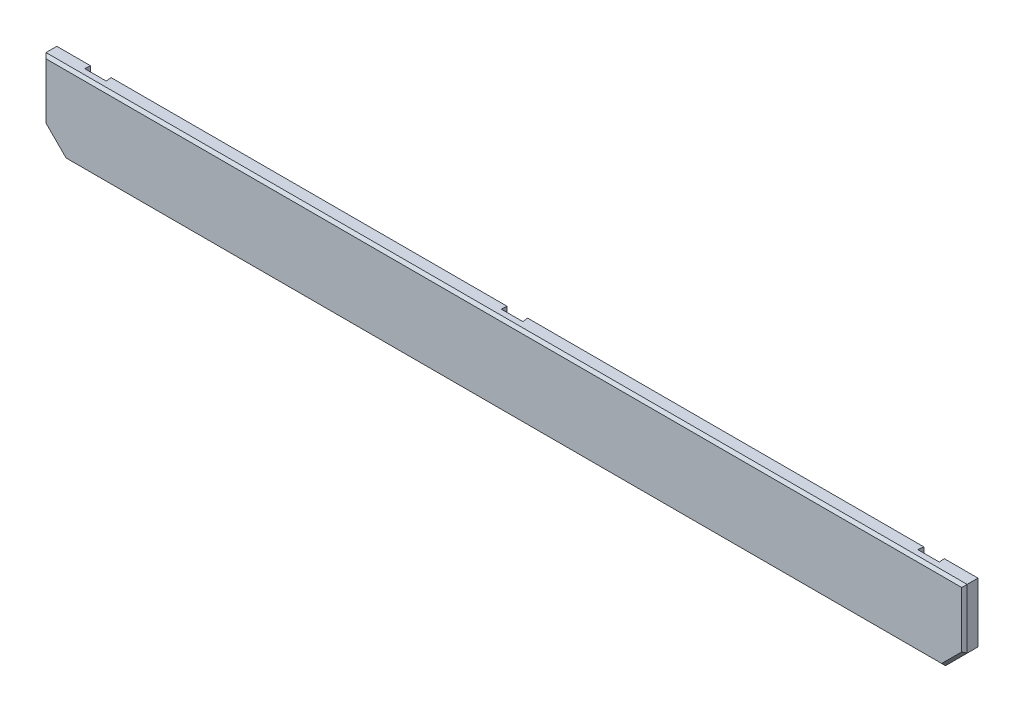
ISO-10303-21;
HEADER;
FILE_DESCRIPTION(('STEP AP214'),'2;1');
FILE_NAME('part.step','',(''),(''),'','','');
FILE_SCHEMA(('AUTOMOTIVE_DESIGN { 1 0 10303 214 1 1 1 1 }'));
ENDSEC;
DATA;
#1=APPLICATION_CONTEXT('core data for automotive mechanical design processes');
#2=APPLICATION_PROTOCOL_DEFINITION('international standard','automotive_design',2000,#1);
#3=PRODUCT_CONTEXT('',#1,'mechanical');
#4=PRODUCT('Part','Part','',(#3));
#5=PRODUCT_RELATED_PRODUCT_CATEGORY('part','',(#4));
#6=PRODUCT_DEFINITION_FORMATION('','',#4);
#7=PRODUCT_DEFINITION_CONTEXT('part definition',#1,'design');
#8=PRODUCT_DEFINITION('design','',#6,#7);
#9=PRODUCT_DEFINITION_SHAPE('','',#8);
#10=(LENGTH_UNIT() NAMED_UNIT(*) SI_UNIT(.MILLI.,.METRE.));
#11=(NAMED_UNIT(*) PLANE_ANGLE_UNIT() SI_UNIT($,.RADIAN.));
#12=(NAMED_UNIT(*) SI_UNIT($,.STERADIAN.) SOLID_ANGLE_UNIT());
#13=UNCERTAINTY_MEASURE_WITH_UNIT(LENGTH_MEASURE(1.E-05),#10,'distance_accuracy_value','');
#14=(GEOMETRIC_REPRESENTATION_CONTEXT(3) GLOBAL_UNCERTAINTY_ASSIGNED_CONTEXT((#13)) GLOBAL_UNIT_ASSIGNED_CONTEXT((#10,
#11,#12)) REPRESENTATION_CONTEXT('',''));
#15=CARTESIAN_POINT('',(0.,0.,0.));
#16=DIRECTION('',(0.,0.,1.));
#17=DIRECTION('',(1.,0.,0.));
#18=AXIS2_PLACEMENT_3D('',#15,#16,#17);
#19=CARTESIAN_POINT('',(0.,0.,0.));
#20=DIRECTION('',(0.,0.,-1.));
#21=DIRECTION('',(-1.,0.,0.));
#22=AXIS2_PLACEMENT_3D('',#19,#20,#21);
#23=PLANE('',#22);
#24=DIRECTION('',(0.,1.,0.));
#25=VECTOR('',#24,1.);
#26=CARTESIAN_POINT('',(100.,0.,0.));
#27=LINE('',#26,#25);
#28=CARTESIAN_POINT('',(100.,0.,0.));
#29=VERTEX_POINT('',#28);
#30=CARTESIAN_POINT('',(100.,150.,0.));
#31=VERTEX_POINT('',#30);
#32=EDGE_CURVE('E212',#29,#31,#27,.T.);
#33=ORIENTED_EDGE('',*,*,#32,.T.);
#34=DIRECTION('',(-1.,0.,0.));
#35=VECTOR('',#34,1.);
#36=CARTESIAN_POINT('',(0.,150.,0.));
#37=LINE('',#36,#35);
#38=CARTESIAN_POINT('',(831.227845609029,150.,0.));
#39=VERTEX_POINT('',#38);
#40=EDGE_CURVE('E405',#39,#31,#37,.T.);
#41=ORIENTED_EDGE('',*,*,#40,.F.);
#42=DIRECTION('',(0.,1.,0.));
#43=VECTOR('',#42,1.);
#44=CARTESIAN_POINT('',(831.227845609029,0.,0.));
#45=LINE('',#44,#43);
#46=CARTESIAN_POINT('',(831.227845609029,0.,0.));
#47=VERTEX_POINT('',#46);
#48=EDGE_CURVE('E250',#47,#39,#45,.T.);
#49=ORIENTED_EDGE('',*,*,#48,.F.);
#50=DIRECTION('',(1.,0.,0.));
#51=VECTOR('',#50,1.);
#52=CARTESIAN_POINT('',(0.,0.,0.));
#53=LINE('',#52,#51);
#54=EDGE_CURVE('E275',#29,#47,#53,.T.);
#55=ORIENTED_EDGE('',*,*,#54,.F.);
#56=EDGE_LOOP('',(#33,#41,#49,#55));
#57=FACE_BOUND('',#56,.T.);
#58=ADVANCED_FACE('F35',(#57),#23,.T.);
#59=DIRECTION('',(0.,1.,0.));
#60=VECTOR('',#59,1.);
#61=CARTESIAN_POINT('',(1700.,0.,0.));
#62=LINE('',#61,#60);
#63=CARTESIAN_POINT('',(1700.,40.0000000000003,0.));
#64=VERTEX_POINT('',#63);
#65=CARTESIAN_POINT('',(1700.,150.,0.));
#66=VERTEX_POINT('',#65);
#67=EDGE_CURVE('E274',#64,#66,#62,.T.);
#68=ORIENTED_EDGE('',*,*,#67,.F.);
#69=DIRECTION('',(0.707106781186548,0.707106781186548,0.));
#70=VECTOR('',#69,1.);
#71=CARTESIAN_POINT('',(830.,-830.,0.));
#72=LINE('',#71,#70);
#73=CARTESIAN_POINT('',(1660.,0.,0.));
#74=VERTEX_POINT('',#73);
#75=EDGE_CURVE('E305',#64,#74,#72,.F.);
#76=ORIENTED_EDGE('',*,*,#75,.T.);
#77=CARTESIAN_POINT('',(1637.54430878194,0.,0.));
#78=VERTEX_POINT('',#77);
#79=EDGE_CURVE('E272',#78,#74,#53,.T.);
#80=ORIENTED_EDGE('',*,*,#79,.F.);
#81=DIRECTION('',(0.,1.,0.));
#82=VECTOR('',#81,1.);
#83=CARTESIAN_POINT('',(1637.54430878194,0.,0.));
#84=LINE('',#83,#82);
#85=CARTESIAN_POINT('',(1637.54430878194,150.,0.));
#86=VERTEX_POINT('',#85);
#87=EDGE_CURVE('E205',#78,#86,#84,.T.);
#88=ORIENTED_EDGE('',*,*,#87,.T.);
#89=EDGE_CURVE('E279',#66,#86,#37,.T.);
#90=ORIENTED_EDGE('',*,*,#89,.F.);
#91=EDGE_LOOP('',(#68,#76,#80,#88,#90));
#92=FACE_BOUND('',#91,.T.);
#93=ADVANCED_FACE('F389',(#92),#23,.T.);
#94=DIRECTION('',(0.,1.,0.));
#95=VECTOR('',#94,1.);
#96=CARTESIAN_POINT('',(1600.,0.,0.));
#97=LINE('',#96,#95);
#98=CARTESIAN_POINT('',(1600.,0.,0.));
#99=VERTEX_POINT('',#98);
#100=CARTESIAN_POINT('',(1600.,150.,0.));
#101=VERTEX_POINT('',#100);
#102=EDGE_CURVE('E227',#99,#101,#97,.T.);
#103=ORIENTED_EDGE('',*,*,#102,.F.);
#104=CARTESIAN_POINT('',(868.772154390971,0.,0.));
#105=VERTEX_POINT('',#104);
#106=EDGE_CURVE('E414',#105,#99,#53,.T.);
#107=ORIENTED_EDGE('',*,*,#106,.F.);
#108=DIRECTION('',(0.,1.,0.));
#109=VECTOR('',#108,1.);
#110=CARTESIAN_POINT('',(868.772154390971,0.,0.));
#111=LINE('',#110,#109);
#112=CARTESIAN_POINT('',(868.772154390971,150.,0.));
#113=VERTEX_POINT('',#112);
#114=EDGE_CURVE('E244',#105,#113,#111,.T.);
#115=ORIENTED_EDGE('',*,*,#114,.T.);
#116=EDGE_CURVE('E283',#101,#113,#37,.T.);
#117=ORIENTED_EDGE('',*,*,#116,.F.);
#118=EDGE_LOOP('',(#103,#107,#115,#117));
#119=FACE_BOUND('',#118,.T.);
#120=ADVANCED_FACE('F402',(#119),#23,.T.);
#121=CARTESIAN_POINT('',(0.,0.,25.));
#122=DIRECTION('',(1.,0.,0.));
#123=DIRECTION('',(0.,0.,-1.));
#124=AXIS2_PLACEMENT_3D('',#121,#122,#123);
#125=PLANE('',#124);
#126=DIRECTION('',(0.,0.,1.));
#127=VECTOR('',#126,1.);
#128=CARTESIAN_POINT('',(0.,40.0000000000003,25.));
#129=LINE('',#128,#127);
#130=CARTESIAN_POINT('',(0.,40.0000000000003,0.));
#131=VERTEX_POINT('',#130);
#132=CARTESIAN_POINT('',(0.,40.0000000000003,20.0000000000001));
#133=VERTEX_POINT('',#132);
#134=EDGE_CURVE('E301',#131,#133,#129,.T.);
#135=ORIENTED_EDGE('',*,*,#134,.T.);
#136=DIRECTION('',(0.,1.,0.));
#137=VECTOR('',#136,1.);
#138=CARTESIAN_POINT('',(0.,0.,20.0000000000001));
#139=LINE('',#138,#137);
#140=CARTESIAN_POINT('',(0.,150.,20.0000000000001));
#141=VERTEX_POINT('',#140);
#142=EDGE_CURVE('E11',#133,#141,#139,.T.);
#143=ORIENTED_EDGE('',*,*,#142,.T.);
#144=DIRECTION('',(0.,0.,-1.));
#145=VECTOR('',#144,1.);
#146=CARTESIAN_POINT('',(0.,150.,25.));
#147=LINE('',#146,#145);
#148=CARTESIAN_POINT('',(0.,150.,0.));
#149=VERTEX_POINT('',#148);
#150=EDGE_CURVE('E282',#141,#149,#147,.T.);
#151=ORIENTED_EDGE('',*,*,#150,.T.);
#152=DIRECTION('',(0.,-1.,0.));
#153=VECTOR('',#152,1.);
#154=CARTESIAN_POINT('',(0.,0.,0.));
#155=LINE('',#154,#153);
#156=EDGE_CURVE('E269',#149,#131,#155,.T.);
#157=ORIENTED_EDGE('',*,*,#156,.T.);
#158=EDGE_LOOP('',(#135,#143,#151,#157));
#159=FACE_BOUND('',#158,.T.);
#160=ADVANCED_FACE('F361',(#159),#125,.F.);
#161=CARTESIAN_POINT('',(0.,0.,25.));
#162=DIRECTION('',(0.,1.,0.));
#163=DIRECTION('',(0.,0.,1.));
#164=AXIS2_PLACEMENT_3D('',#161,#162,#163);
#165=PLANE('',#164);
#166=DIRECTION('',(0.,0.,1.));
#167=VECTOR('',#166,1.);
#168=CARTESIAN_POINT('',(1660.,0.,25.));
#169=LINE('',#168,#167);
#170=CARTESIAN_POINT('',(1660.,0.,20.0000000000001));
#171=VERTEX_POINT('',#170);
#172=EDGE_CURVE('E295',#74,#171,#169,.T.);
#173=ORIENTED_EDGE('',*,*,#172,.T.);
#174=DIRECTION('',(-1.,0.,0.));
#175=VECTOR('',#174,1.);
#176=CARTESIAN_POINT('',(0.,0.,20.0000000000001));
#177=LINE('',#176,#175);
#178=CARTESIAN_POINT('',(40.0000000000003,0.,20.0000000000001));
#179=VERTEX_POINT('',#178);
#180=EDGE_CURVE('E60',#171,#179,#177,.T.);
#181=ORIENTED_EDGE('',*,*,#180,.T.);
#182=DIRECTION('',(0.,0.,-1.));
#183=VECTOR('',#182,1.);
#184=CARTESIAN_POINT('',(40.0000000000003,0.,25.));
#185=LINE('',#184,#183);
#186=CARTESIAN_POINT('',(40.0000000000003,0.,0.));
#187=VERTEX_POINT('',#186);
#188=EDGE_CURVE('E297',#179,#187,#185,.T.);
#189=ORIENTED_EDGE('',*,*,#188,.T.);
#190=CARTESIAN_POINT('',(62.4556912180578,0.,0.));
#191=VERTEX_POINT('',#190);
#192=EDGE_CURVE('E204',#187,#191,#53,.T.);
#193=ORIENTED_EDGE('',*,*,#192,.T.);
#194=DIRECTION('',(-0.121869343405132,0.,0.992546151641324));
#195=VECTOR('',#194,1.);
#196=CARTESIAN_POINT('',(62.4556912180578,0.,0.));
#197=LINE('',#196,#195);
#198=CARTESIAN_POINT('',(61.2278456090289,0.,10.));
#199=VERTEX_POINT('',#198);
#200=EDGE_CURVE('E185',#191,#199,#197,.T.);
#201=ORIENTED_EDGE('',*,*,#200,.T.);
#202=DIRECTION('',(1.,0.,0.));
#203=VECTOR('',#202,1.);
#204=CARTESIAN_POINT('',(101.227845609029,0.,10.));
#205=LINE('',#204,#203);
#206=CARTESIAN_POINT('',(101.227845609029,0.,10.));
#207=VERTEX_POINT('',#206);
#208=EDGE_CURVE('E195',#199,#207,#205,.T.);
#209=ORIENTED_EDGE('',*,*,#208,.T.);
#210=DIRECTION('',(-0.12186934340514,0.,-0.992546151641323));
#211=VECTOR('',#210,1.);
#212=CARTESIAN_POINT('',(100.,0.,0.));
#213=LINE('',#212,#211);
#214=EDGE_CURVE('E200',#207,#29,#213,.T.);
#215=ORIENTED_EDGE('',*,*,#214,.T.);
#216=ORIENTED_EDGE('',*,*,#54,.T.);
#217=DIRECTION('',(-0.121869343405143,0.,0.992546151641323));
#218=VECTOR('',#217,1.);
#219=CARTESIAN_POINT('',(831.227845609029,0.,0.));
#220=LINE('',#219,#218);
#221=CARTESIAN_POINT('',(830.,0.,10.));
#222=VERTEX_POINT('',#221);
#223=EDGE_CURVE('E238',#47,#222,#220,.T.);
#224=ORIENTED_EDGE('',*,*,#223,.T.);
#225=DIRECTION('',(1.,0.,0.));
#226=VECTOR('',#225,1.);
#227=CARTESIAN_POINT('',(830.,0.,10.));
#228=LINE('',#227,#226);
#229=CARTESIAN_POINT('',(870.,0.,10.));
#230=VERTEX_POINT('',#229);
#231=EDGE_CURVE('E241',#222,#230,#228,.T.);
#232=ORIENTED_EDGE('',*,*,#231,.T.);
#233=DIRECTION('',(-0.121869343405165,0.,-0.99254615164132));
#234=VECTOR('',#233,1.);
#235=CARTESIAN_POINT('',(868.772154390971,0.,0.));
#236=LINE('',#235,#234);
#237=EDGE_CURVE('E235',#230,#105,#236,.T.);
#238=ORIENTED_EDGE('',*,*,#237,.T.);
#239=ORIENTED_EDGE('',*,*,#106,.T.);
#240=DIRECTION('',(-0.121869343405132,0.,0.992546151641324));
#241=VECTOR('',#240,1.);
#242=CARTESIAN_POINT('',(1600.,0.,0.));
#243=LINE('',#242,#241);
#244=CARTESIAN_POINT('',(1598.77215439097,0.,10.));
#245=VERTEX_POINT('',#244);
#246=EDGE_CURVE('E218',#99,#245,#243,.T.);
#247=ORIENTED_EDGE('',*,*,#246,.T.);
#248=DIRECTION('',(1.,0.,0.));
#249=VECTOR('',#248,1.);
#250=CARTESIAN_POINT('',(1598.77215439097,0.,10.));
#251=LINE('',#250,#249);
#252=CARTESIAN_POINT('',(1638.77215439097,0.,10.));
#253=VERTEX_POINT('',#252);
#254=EDGE_CURVE('E221',#245,#253,#251,.T.);
#255=ORIENTED_EDGE('',*,*,#254,.T.);
#256=DIRECTION('',(-0.121869343405132,0.,-0.992546151641324));
#257=VECTOR('',#256,1.);
#258=CARTESIAN_POINT('',(1637.54430878194,0.,0.));
#259=LINE('',#258,#257);
#260=EDGE_CURVE('E225',#253,#78,#259,.T.);
#261=ORIENTED_EDGE('',*,*,#260,.T.);
#262=ORIENTED_EDGE('',*,*,#79,.T.);
#263=EDGE_LOOP('',(#173,#181,#189,#193,#201,#209,#215,#216,#224,#232,#238,#239,#247,#255,#261,#262));
#264=FACE_BOUND('',#263,.T.);
#265=ADVANCED_FACE('F202',(#264),#165,.F.);
#266=CARTESIAN_POINT('',(1700.,0.,25.));
#267=DIRECTION('',(-1.,0.,0.));
#268=DIRECTION('',(0.,0.,1.));
#269=AXIS2_PLACEMENT_3D('',#266,#267,#268);
#270=PLANE('',#269);
#271=DIRECTION('',(0.,0.,-1.));
#272=VECTOR('',#271,1.);
#273=CARTESIAN_POINT('',(1700.,150.,25.));
#274=LINE('',#273,#272);
#275=CARTESIAN_POINT('',(1700.,150.,20.0000000000001));
#276=VERTEX_POINT('',#275);
#277=EDGE_CURVE('E285',#276,#66,#274,.T.);
#278=ORIENTED_EDGE('',*,*,#277,.F.);
#279=DIRECTION('',(0.,-1.,0.));
#280=VECTOR('',#279,1.);
#281=CARTESIAN_POINT('',(1700.,0.,20.0000000000001));
#282=LINE('',#281,#280);
#283=CARTESIAN_POINT('',(1700.,40.0000000000003,20.0000000000001));
#284=VERTEX_POINT('',#283);
#285=EDGE_CURVE('E323',#276,#284,#282,.T.);
#286=ORIENTED_EDGE('',*,*,#285,.T.);
#287=DIRECTION('',(0.,0.,-1.));
#288=VECTOR('',#287,1.);
#289=CARTESIAN_POINT('',(1700.,40.0000000000003,25.));
#290=LINE('',#289,#288);
#291=EDGE_CURVE('E303',#284,#64,#290,.T.);
#292=ORIENTED_EDGE('',*,*,#291,.T.);
#293=ORIENTED_EDGE('',*,*,#67,.T.);
#294=EDGE_LOOP('',(#278,#286,#292,#293));
#295=FACE_BOUND('',#294,.T.);
#296=ADVANCED_FACE('F379',(#295),#270,.F.);
#297=CARTESIAN_POINT('',(0.,150.,25.));
#298=DIRECTION('',(0.,-1.,0.));
#299=DIRECTION('',(0.,0.,-1.));
#300=AXIS2_PLACEMENT_3D('',#297,#298,#299);
#301=PLANE('',#300);
#302=ORIENTED_EDGE('',*,*,#150,.F.);
#303=DIRECTION('',(1.,0.,0.));
#304=VECTOR('',#303,1.);
#305=CARTESIAN_POINT('',(0.,150.,20.0000000000001));
#306=LINE('',#305,#304);
#307=EDGE_CURVE('E320',#141,#276,#306,.T.);
#308=ORIENTED_EDGE('',*,*,#307,.T.);
#309=ORIENTED_EDGE('',*,*,#277,.T.);
#310=ORIENTED_EDGE('',*,*,#89,.T.);
#311=DIRECTION('',(0.121869343405132,0.,0.992546151641324));
#312=VECTOR('',#311,1.);
#313=CARTESIAN_POINT('',(1616.24730028532,150.,-173.450215076013));
#314=LINE('',#313,#312);
#315=CARTESIAN_POINT('',(1638.77215439097,150.,10.));
#316=VERTEX_POINT('',#315);
#317=EDGE_CURVE('E262',#86,#316,#314,.T.);
#318=ORIENTED_EDGE('',*,*,#317,.T.);
#319=DIRECTION('',(-1.,0.,0.));
#320=VECTOR('',#319,1.);
#321=CARTESIAN_POINT('',(0.,150.,10.));
#322=LINE('',#321,#320);
#323=CARTESIAN_POINT('',(1598.77215439097,150.,10.));
#324=VERTEX_POINT('',#323);
#325=EDGE_CURVE('E290',#316,#324,#322,.T.);
#326=ORIENTED_EDGE('',*,*,#325,.T.);
#327=DIRECTION('',(0.121869343405132,0.,-0.992546151641324));
#328=VECTOR('',#327,1.);
#329=CARTESIAN_POINT('',(1573.21255732581,150.,218.16621305816));
#330=LINE('',#329,#328);
#331=EDGE_CURVE('E259',#324,#101,#330,.T.);
#332=ORIENTED_EDGE('',*,*,#331,.T.);
#333=ORIENTED_EDGE('',*,*,#116,.T.);
#334=DIRECTION('',(0.121869343405165,0.,0.99254615164132));
#335=VECTOR('',#334,1.);
#336=CARTESIAN_POINT('',(858.893055147053,150.,-80.4588066388001));
#337=LINE('',#336,#335);
#338=CARTESIAN_POINT('',(870.,150.,10.));
#339=VERTEX_POINT('',#338);
#340=EDGE_CURVE('E256',#113,#339,#337,.T.);
#341=ORIENTED_EDGE('',*,*,#340,.T.);
#342=DIRECTION('',(-1.,0.,0.));
#343=VECTOR('',#342,1.);
#344=CARTESIAN_POINT('',(0.,150.,10.));
#345=LINE('',#344,#343);
#346=CARTESIAN_POINT('',(830.,150.,10.));
#347=VERTEX_POINT('',#346);
#348=EDGE_CURVE('E287',#339,#347,#345,.T.);
#349=ORIENTED_EDGE('',*,*,#348,.T.);
#350=DIRECTION('',(0.121869343405143,0.,-0.992546151641323));
#351=VECTOR('',#350,1.);
#352=CARTESIAN_POINT('',(815.858312187542,150.,125.174804620928));
#353=LINE('',#352,#351);
#354=EDGE_CURVE('E215',#347,#39,#353,.T.);
#355=ORIENTED_EDGE('',*,*,#354,.T.);
#356=ORIENTED_EDGE('',*,*,#40,.T.);
#357=DIRECTION('',(0.12186934340514,0.,0.992546151641323));
#358=VECTOR('',#357,1.);
#359=CARTESIAN_POINT('',(101.538810008796,150.,12.5326017984673));
#360=LINE('',#359,#358);
#361=CARTESIAN_POINT('',(101.227845609029,150.,10.));
#362=VERTEX_POINT('',#361);
#363=EDGE_CURVE('E266',#31,#362,#360,.T.);
#364=ORIENTED_EDGE('',*,*,#363,.T.);
#365=DIRECTION('',(-1.,0.,0.));
#366=VECTOR('',#365,1.);
#367=CARTESIAN_POINT('',(0.,150.,10.));
#368=LINE('',#367,#366);
#369=CARTESIAN_POINT('',(61.2278456090289,150.,10.));
#370=VERTEX_POINT('',#369);
#371=EDGE_CURVE('E293',#362,#370,#368,.T.);
#372=ORIENTED_EDGE('',*,*,#371,.T.);
#373=DIRECTION('',(0.121869343405132,0.,-0.992546151641324));
#374=VECTOR('',#373,1.);
#375=CARTESIAN_POINT('',(58.5040670492811,150.,32.1833961836791));
#376=LINE('',#375,#374);
#377=CARTESIAN_POINT('',(62.4556912180578,150.,0.));
#378=VERTEX_POINT('',#377);
#379=EDGE_CURVE('E188',#370,#378,#376,.T.);
#380=ORIENTED_EDGE('',*,*,#379,.T.);
#381=EDGE_CURVE('E278',#378,#149,#37,.T.);
#382=ORIENTED_EDGE('',*,*,#381,.T.);
#383=EDGE_LOOP('',(#302,#308,#309,#310,#318,#326,#332,#333,#341,#349,#355,#356,#364,#372,#380,#382));
#384=FACE_BOUND('',#383,.T.);
#385=ADVANCED_FACE('F365',(#384),#301,.F.);
#386=CARTESIAN_POINT('',(0.,0.,25.));
#387=DIRECTION('',(0.,0.,-1.));
#388=DIRECTION('',(-1.,0.,0.));
#389=AXIS2_PLACEMENT_3D('',#386,#387,#388);
#390=PLANE('',#389);
#391=DIRECTION('',(0.,1.,0.));
#392=VECTOR('',#391,1.);
#393=CARTESIAN_POINT('',(1695.,0.,25.));
#394=LINE('',#393,#392);
#395=CARTESIAN_POINT('',(1695.,42.0710678118657,25.));
#396=VERTEX_POINT('',#395);
#397=CARTESIAN_POINT('',(1695.,145.,25.));
#398=VERTEX_POINT('',#397);
#399=EDGE_CURVE('E315',#396,#398,#394,.T.);
#400=ORIENTED_EDGE('',*,*,#399,.T.);
#401=DIRECTION('',(-1.,0.,0.));
#402=VECTOR('',#401,1.);
#403=CARTESIAN_POINT('',(0.,145.,25.));
#404=LINE('',#403,#402);
#405=CARTESIAN_POINT('',(4.99999999999989,145.,25.));
#406=VERTEX_POINT('',#405);
#407=EDGE_CURVE('E317',#398,#406,#404,.T.);
#408=ORIENTED_EDGE('',*,*,#407,.T.);
#409=DIRECTION('',(0.,-1.,0.));
#410=VECTOR('',#409,1.);
#411=CARTESIAN_POINT('',(4.99999999999989,0.,25.));
#412=LINE('',#411,#410);
#413=CARTESIAN_POINT('',(4.99999999999989,42.0710678118657,25.));
#414=VERTEX_POINT('',#413);
#415=EDGE_CURVE('E307',#406,#414,#412,.T.);
#416=ORIENTED_EDGE('',*,*,#415,.T.);
#417=DIRECTION('',(0.707106781186548,-0.707106781186548,0.));
#418=VECTOR('',#417,1.);
#419=CARTESIAN_POINT('',(43.5355339059329,3.53553390593266,25.));
#420=LINE('',#419,#418);
#421=CARTESIAN_POINT('',(42.0710678118657,4.99999999999989,25.));
#422=VERTEX_POINT('',#421);
#423=EDGE_CURVE('E309',#414,#422,#420,.T.);
#424=ORIENTED_EDGE('',*,*,#423,.T.);
#425=DIRECTION('',(1.,0.,0.));
#426=VECTOR('',#425,1.);
#427=CARTESIAN_POINT('',(0.,4.99999999999989,25.));
#428=LINE('',#427,#426);
#429=CARTESIAN_POINT('',(1657.92893218813,4.99999999999989,25.));
#430=VERTEX_POINT('',#429);
#431=EDGE_CURVE('E311',#422,#430,#428,.T.);
#432=ORIENTED_EDGE('',*,*,#431,.T.);
#433=DIRECTION('',(0.707106781186548,0.707106781186548,0.));
#434=VECTOR('',#433,1.);
#435=CARTESIAN_POINT('',(1696.46446609407,43.5355339059329,25.));
#436=LINE('',#435,#434);
#437=EDGE_CURVE('E313',#430,#396,#436,.T.);
#438=ORIENTED_EDGE('',*,*,#437,.T.);
#439=EDGE_LOOP('',(#400,#408,#416,#424,#432,#438));
#440=FACE_BOUND('',#439,.T.);
#441=ADVANCED_FACE('F441',(#440),#390,.F.);
#442=ORIENTED_EDGE('',*,*,#192,.F.);
#443=DIRECTION('',(0.707106781186548,-0.707106781186548,0.));
#444=VECTOR('',#443,1.);
#445=CARTESIAN_POINT('',(20.0000000000001,20.0000000000001,0.));
#446=LINE('',#445,#444);
#447=EDGE_CURVE('E299',#187,#131,#446,.F.);
#448=ORIENTED_EDGE('',*,*,#447,.T.);
#449=ORIENTED_EDGE('',*,*,#156,.F.);
#450=ORIENTED_EDGE('',*,*,#381,.F.);
#451=DIRECTION('',(0.,1.,0.));
#452=VECTOR('',#451,1.);
#453=CARTESIAN_POINT('',(62.4556912180578,0.,0.));
#454=LINE('',#453,#452);
#455=EDGE_CURVE('E192',#191,#378,#454,.T.);
#456=ORIENTED_EDGE('',*,*,#455,.F.);
#457=EDGE_LOOP('',(#442,#448,#449,#450,#456));
#458=FACE_BOUND('',#457,.T.);
#459=ADVANCED_FACE('F434',(#458),#23,.T.);
#460=CARTESIAN_POINT('',(830.,0.,10.));
#461=DIRECTION('',(0.,0.,1.));
#462=DIRECTION('',(1.,0.,0.));
#463=AXIS2_PLACEMENT_3D('',#460,#461,#462);
#464=PLANE('',#463);
#465=DIRECTION('',(0.,1.,0.));
#466=VECTOR('',#465,1.);
#467=CARTESIAN_POINT('',(870.,0.,10.));
#468=LINE('',#467,#466);
#469=EDGE_CURVE('E222',#230,#339,#468,.T.);
#470=ORIENTED_EDGE('',*,*,#469,.F.);
#471=ORIENTED_EDGE('',*,*,#231,.F.);
#472=DIRECTION('',(0.,1.,0.));
#473=VECTOR('',#472,1.);
#474=CARTESIAN_POINT('',(830.,0.,10.));
#475=LINE('',#474,#473);
#476=EDGE_CURVE('E247',#222,#347,#475,.T.);
#477=ORIENTED_EDGE('',*,*,#476,.T.);
#478=ORIENTED_EDGE('',*,*,#348,.F.);
#479=EDGE_LOOP('',(#470,#471,#477,#478));
#480=FACE_BOUND('',#479,.T.);
#481=ADVANCED_FACE('F420',(#480),#464,.F.);
#482=CARTESIAN_POINT('',(868.772154390971,0.,0.));
#483=DIRECTION('',(0.99254615164132,0.,-0.121869343405165));
#484=DIRECTION('',(-0.121869343405165,0.,-0.99254615164132));
#485=AXIS2_PLACEMENT_3D('',#482,#483,#484);
#486=PLANE('',#485);
#487=ORIENTED_EDGE('',*,*,#114,.F.);
#488=ORIENTED_EDGE('',*,*,#237,.F.);
#489=ORIENTED_EDGE('',*,*,#469,.T.);
#490=ORIENTED_EDGE('',*,*,#340,.F.);
#491=EDGE_LOOP('',(#487,#488,#489,#490));
#492=FACE_BOUND('',#491,.T.);
#493=ADVANCED_FACE('F418',(#492),#486,.F.);
#494=CARTESIAN_POINT('',(831.227845609029,0.,0.));
#495=DIRECTION('',(-0.992546151641323,0.,-0.121869343405143));
#496=DIRECTION('',(-0.121869343405143,0.,0.992546151641323));
#497=AXIS2_PLACEMENT_3D('',#494,#495,#496);
#498=PLANE('',#497);
#499=ORIENTED_EDGE('',*,*,#476,.F.);
#500=ORIENTED_EDGE('',*,*,#223,.F.);
#501=ORIENTED_EDGE('',*,*,#48,.T.);
#502=ORIENTED_EDGE('',*,*,#354,.F.);
#503=EDGE_LOOP('',(#499,#500,#501,#502));
#504=FACE_BOUND('',#503,.T.);
#505=ADVANCED_FACE('F422',(#504),#498,.F.);
#506=CARTESIAN_POINT('',(1598.77215439097,0.,10.));
#507=DIRECTION('',(0.,0.,1.));
#508=DIRECTION('',(1.,0.,0.));
#509=AXIS2_PLACEMENT_3D('',#506,#507,#508);
#510=PLANE('',#509);
#511=DIRECTION('',(0.,1.,0.));
#512=VECTOR('',#511,1.);
#513=CARTESIAN_POINT('',(1638.77215439097,0.,10.));
#514=LINE('',#513,#512);
#515=EDGE_CURVE('E208',#253,#316,#514,.T.);
#516=ORIENTED_EDGE('',*,*,#515,.F.);
#517=ORIENTED_EDGE('',*,*,#254,.F.);
#518=DIRECTION('',(0.,1.,0.));
#519=VECTOR('',#518,1.);
#520=CARTESIAN_POINT('',(1598.77215439097,0.,10.));
#521=LINE('',#520,#519);
#522=EDGE_CURVE('E231',#245,#324,#521,.T.);
#523=ORIENTED_EDGE('',*,*,#522,.T.);
#524=ORIENTED_EDGE('',*,*,#325,.F.);
#525=EDGE_LOOP('',(#516,#517,#523,#524));
#526=FACE_BOUND('',#525,.T.);
#527=ADVANCED_FACE('F395',(#526),#510,.F.);
#528=CARTESIAN_POINT('',(1637.54430878194,0.,0.));
#529=DIRECTION('',(0.992546151641324,0.,-0.121869343405132));
#530=DIRECTION('',(-0.121869343405132,0.,-0.992546151641324));
#531=AXIS2_PLACEMENT_3D('',#528,#529,#530);
#532=PLANE('',#531);
#533=ORIENTED_EDGE('',*,*,#87,.F.);
#534=ORIENTED_EDGE('',*,*,#260,.F.);
#535=ORIENTED_EDGE('',*,*,#515,.T.);
#536=ORIENTED_EDGE('',*,*,#317,.F.);
#537=EDGE_LOOP('',(#533,#534,#535,#536));
#538=FACE_BOUND('',#537,.T.);
#539=ADVANCED_FACE('F391',(#538),#532,.F.);
#540=CARTESIAN_POINT('',(1600.,0.,0.));
#541=DIRECTION('',(-0.992546151641324,0.,-0.121869343405132));
#542=DIRECTION('',(-0.121869343405132,0.,0.992546151641324));
#543=AXIS2_PLACEMENT_3D('',#540,#541,#542);
#544=PLANE('',#543);
#545=ORIENTED_EDGE('',*,*,#522,.F.);
#546=ORIENTED_EDGE('',*,*,#246,.F.);
#547=ORIENTED_EDGE('',*,*,#102,.T.);
#548=ORIENTED_EDGE('',*,*,#331,.F.);
#549=EDGE_LOOP('',(#545,#546,#547,#548));
#550=FACE_BOUND('',#549,.T.);
#551=ADVANCED_FACE('F397',(#550),#544,.F.);
#552=CARTESIAN_POINT('',(101.227845609029,0.,10.));
#553=DIRECTION('',(0.,0.,1.));
#554=DIRECTION('',(1.,0.,0.));
#555=AXIS2_PLACEMENT_3D('',#552,#553,#554);
#556=PLANE('',#555);
#557=DIRECTION('',(0.,1.,0.));
#558=VECTOR('',#557,1.);
#559=CARTESIAN_POINT('',(101.227845609029,0.,10.));
#560=LINE('',#559,#558);
#561=EDGE_CURVE('E191',#207,#362,#560,.T.);
#562=ORIENTED_EDGE('',*,*,#561,.F.);
#563=ORIENTED_EDGE('',*,*,#208,.F.);
#564=DIRECTION('',(0.,1.,0.));
#565=VECTOR('',#564,1.);
#566=CARTESIAN_POINT('',(61.2278456090289,0.,10.));
#567=LINE('',#566,#565);
#568=EDGE_CURVE('E181',#199,#370,#567,.T.);
#569=ORIENTED_EDGE('',*,*,#568,.T.);
#570=ORIENTED_EDGE('',*,*,#371,.F.);
#571=EDGE_LOOP('',(#562,#563,#569,#570));
#572=FACE_BOUND('',#571,.T.);
#573=ADVANCED_FACE('F196',(#572),#556,.F.);
#574=CARTESIAN_POINT('',(100.,0.,0.));
#575=DIRECTION('',(0.992546151641323,0.,-0.12186934340514));
#576=DIRECTION('',(-0.12186934340514,0.,-0.992546151641323));
#577=AXIS2_PLACEMENT_3D('',#574,#575,#576);
#578=PLANE('',#577);
#579=ORIENTED_EDGE('',*,*,#32,.F.);
#580=ORIENTED_EDGE('',*,*,#214,.F.);
#581=ORIENTED_EDGE('',*,*,#561,.T.);
#582=ORIENTED_EDGE('',*,*,#363,.F.);
#583=EDGE_LOOP('',(#579,#580,#581,#582));
#584=FACE_BOUND('',#583,.T.);
#585=ADVANCED_FACE('F413',(#584),#578,.F.);
#586=CARTESIAN_POINT('',(62.4556912180578,0.,0.));
#587=DIRECTION('',(-0.992546151641324,0.,-0.121869343405132));
#588=DIRECTION('',(-0.121869343405132,0.,0.992546151641324));
#589=AXIS2_PLACEMENT_3D('',#586,#587,#588);
#590=PLANE('',#589);
#591=ORIENTED_EDGE('',*,*,#568,.F.);
#592=ORIENTED_EDGE('',*,*,#200,.F.);
#593=ORIENTED_EDGE('',*,*,#455,.T.);
#594=ORIENTED_EDGE('',*,*,#379,.F.);
#595=EDGE_LOOP('',(#591,#592,#593,#594));
#596=FACE_BOUND('',#595,.T.);
#597=ADVANCED_FACE('F183',(#596),#590,.F.);
#598=CARTESIAN_POINT('',(40.0000000000003,0.,25.));
#599=DIRECTION('',(0.707106781186547,0.707106781186547,0.));
#600=DIRECTION('',(0.,0.,-1.));
#601=AXIS2_PLACEMENT_3D('',#598,#599,#600);
#602=PLANE('',#601);
#603=ORIENTED_EDGE('',*,*,#188,.F.);
#604=DIRECTION('',(0.707106781186548,-0.707106781186548,0.));
#605=VECTOR('',#604,1.);
#606=CARTESIAN_POINT('',(0.,40.0000000000003,20.0000000000001));
#607=LINE('',#606,#605);
#608=EDGE_CURVE('E45',#179,#133,#607,.F.);
#609=ORIENTED_EDGE('',*,*,#608,.T.);
#610=ORIENTED_EDGE('',*,*,#134,.F.);
#611=ORIENTED_EDGE('',*,*,#447,.F.);
#612=EDGE_LOOP('',(#603,#609,#610,#611));
#613=FACE_BOUND('',#612,.T.);
#614=ADVANCED_FACE('F460',(#613),#602,.F.);
#615=CARTESIAN_POINT('',(1700.,40.0000000000003,25.));
#616=DIRECTION('',(-0.707106781186547,0.707106781186547,0.));
#617=DIRECTION('',(0.,0.,-1.));
#618=AXIS2_PLACEMENT_3D('',#615,#616,#617);
#619=PLANE('',#618);
#620=ORIENTED_EDGE('',*,*,#291,.F.);
#621=DIRECTION('',(0.707106781186548,0.707106781186548,0.));
#622=VECTOR('',#621,1.);
#623=CARTESIAN_POINT('',(1660.,0.,20.0000000000001));
#624=LINE('',#623,#622);
#625=EDGE_CURVE('E325',#284,#171,#624,.F.);
#626=ORIENTED_EDGE('',*,*,#625,.T.);
#627=ORIENTED_EDGE('',*,*,#172,.F.);
#628=ORIENTED_EDGE('',*,*,#75,.F.);
#629=EDGE_LOOP('',(#620,#626,#627,#628));
#630=FACE_BOUND('',#629,.T.);
#631=ADVANCED_FACE('F382',(#630),#619,.F.);
#632=CARTESIAN_POINT('',(0.,4.99999999999989,25.));
#633=DIRECTION('',(0.,0.707106781186548,-0.707106781186548));
#634=DIRECTION('',(1.,0.,0.));
#635=AXIS2_PLACEMENT_3D('',#632,#633,#634);
#636=PLANE('',#635);
#637=DIRECTION('',(0.281084637714819,0.678598344545847,0.678598344545847));
#638=VECTOR('',#637,1.);
#639=CARTESIAN_POINT('',(44.1421356237312,9.99999999999995,30.0000000000001));
#640=LINE('',#639,#638);
#641=EDGE_CURVE('E338',#179,#422,#640,.T.);
#642=ORIENTED_EDGE('',*,*,#641,.F.);
#643=ORIENTED_EDGE('',*,*,#180,.F.);
#644=DIRECTION('',(-0.28108463771482,0.678598344545847,0.678598344545847));
#645=VECTOR('',#644,1.);
#646=CARTESIAN_POINT('',(1526.9383321933,321.23928305091,341.23928305091));
#647=LINE('',#646,#645);
#648=EDGE_CURVE('E40',#430,#171,#647,.F.);
#649=ORIENTED_EDGE('',*,*,#648,.F.);
#650=ORIENTED_EDGE('',*,*,#431,.F.);
#651=EDGE_LOOP('',(#642,#643,#649,#650));
#652=FACE_BOUND('',#651,.T.);
#653=ADVANCED_FACE('F38',(#652),#636,.F.);
#654=CARTESIAN_POINT('',(826.464466094067,-826.464466094067,25.));
#655=DIRECTION('',(-0.5,0.5,-0.707106781186547));
#656=DIRECTION('',(0.707106781186548,0.707106781186548,0.));
#657=AXIS2_PLACEMENT_3D('',#654,#655,#656);
#658=PLANE('',#657);
#659=ORIENTED_EDGE('',*,*,#648,.T.);
#660=ORIENTED_EDGE('',*,*,#625,.F.);
#661=DIRECTION('',(-0.678598344545847,0.28108463771482,0.678598344545847));
#662=VECTOR('',#661,1.);
#663=CARTESIAN_POINT('',(1460.71067811865,139.116882454314,259.289321881345));
#664=LINE('',#663,#662);
#665=EDGE_CURVE('E336',#396,#284,#664,.F.);
#666=ORIENTED_EDGE('',*,*,#665,.F.);
#667=ORIENTED_EDGE('',*,*,#437,.F.);
#668=EDGE_LOOP('',(#659,#660,#666,#667));
#669=FACE_BOUND('',#668,.T.);
#670=ADVANCED_FACE('F348',(#669),#658,.F.);
#671=CARTESIAN_POINT('',(23.5355339059328,23.5355339059328,25.));
#672=DIRECTION('',(0.5,0.5,-0.707106781186547));
#673=DIRECTION('',(0.707106781186548,-0.707106781186548,0.));
#674=AXIS2_PLACEMENT_3D('',#671,#672,#673);
#675=PLANE('',#674);
#676=ORIENTED_EDGE('',*,*,#641,.T.);
#677=ORIENTED_EDGE('',*,*,#423,.F.);
#678=DIRECTION('',(0.678598344545847,0.281084637714819,0.678598344545847));
#679=VECTOR('',#678,1.);
#680=CARTESIAN_POINT('',(-3.02478566101833,38.7470927559348,16.9752143389818));
#681=LINE('',#680,#679);
#682=EDGE_CURVE('E333',#133,#414,#681,.T.);
#683=ORIENTED_EDGE('',*,*,#682,.F.);
#684=ORIENTED_EDGE('',*,*,#608,.F.);
#685=EDGE_LOOP('',(#676,#677,#683,#684));
#686=FACE_BOUND('',#685,.T.);
#687=ADVANCED_FACE('F353',(#686),#675,.F.);
#688=CARTESIAN_POINT('',(1695.,0.,25.));
#689=DIRECTION('',(-0.707106781186548,0.,-0.707106781186548));
#690=DIRECTION('',(0.,1.,0.));
#691=AXIS2_PLACEMENT_3D('',#688,#689,#690);
#692=PLANE('',#691);
#693=ORIENTED_EDGE('',*,*,#665,.T.);
#694=ORIENTED_EDGE('',*,*,#285,.F.);
#695=DIRECTION('',(-0.577350269189626,-0.577350269189626,0.577350269189626));
#696=VECTOR('',#695,1.);
#697=CARTESIAN_POINT('',(1646.66666666667,96.6666666666667,73.3333333333334));
#698=LINE('',#697,#696);
#699=EDGE_CURVE('E331',#398,#276,#698,.F.);
#700=ORIENTED_EDGE('',*,*,#699,.F.);
#701=ORIENTED_EDGE('',*,*,#399,.F.);
#702=EDGE_LOOP('',(#693,#694,#700,#701));
#703=FACE_BOUND('',#702,.T.);
#704=ADVANCED_FACE('F376',(#703),#692,.F.);
#705=CARTESIAN_POINT('',(4.99999999999989,0.,25.));
#706=DIRECTION('',(0.707106781186548,0.,-0.707106781186548));
#707=DIRECTION('',(0.,-1.,0.));
#708=AXIS2_PLACEMENT_3D('',#705,#706,#707);
#709=PLANE('',#708);
#710=ORIENTED_EDGE('',*,*,#682,.T.);
#711=ORIENTED_EDGE('',*,*,#415,.F.);
#712=DIRECTION('',(-0.577350269189626,0.577350269189626,-0.577350269189626));
#713=VECTOR('',#712,1.);
#714=CARTESIAN_POINT('',(53.3333333333333,96.6666666666667,73.3333333333334));
#715=LINE('',#714,#713);
#716=EDGE_CURVE('E329',#141,#406,#715,.F.);
#717=ORIENTED_EDGE('',*,*,#716,.F.);
#718=ORIENTED_EDGE('',*,*,#142,.F.);
#719=EDGE_LOOP('',(#710,#711,#717,#718));
#720=FACE_BOUND('',#719,.T.);
#721=ADVANCED_FACE('F358',(#720),#709,.F.);
#722=CARTESIAN_POINT('',(0.,145.,25.));
#723=DIRECTION('',(0.,-0.707106781186548,-0.707106781186548));
#724=DIRECTION('',(-1.,0.,0.));
#725=AXIS2_PLACEMENT_3D('',#722,#723,#724);
#726=PLANE('',#725);
#727=ORIENTED_EDGE('',*,*,#699,.T.);
#728=ORIENTED_EDGE('',*,*,#307,.F.);
#729=ORIENTED_EDGE('',*,*,#716,.T.);
#730=ORIENTED_EDGE('',*,*,#407,.F.);
#731=EDGE_LOOP('',(#727,#728,#729,#730));
#732=FACE_BOUND('',#731,.T.);
#733=ADVANCED_FACE('F370',(#732),#726,.F.);
#734=CLOSED_SHELL('',(#58,#93,#120,#160,#265,#296,#385,#441,#459,#481,#493,#505,#527,#539,#551,
#573,#585,#597,#614,#631,#653,#670,#687,#704,#721,#733));
#735=MANIFOLD_SOLID_BREP('B2',#734);
#736=ADVANCED_BREP_SHAPE_REPRESENTATION('',(#18,#735),#14);
#737=SHAPE_DEFINITION_REPRESENTATION(#9,#736);
ENDSEC;
END-ISO-10303-21;
